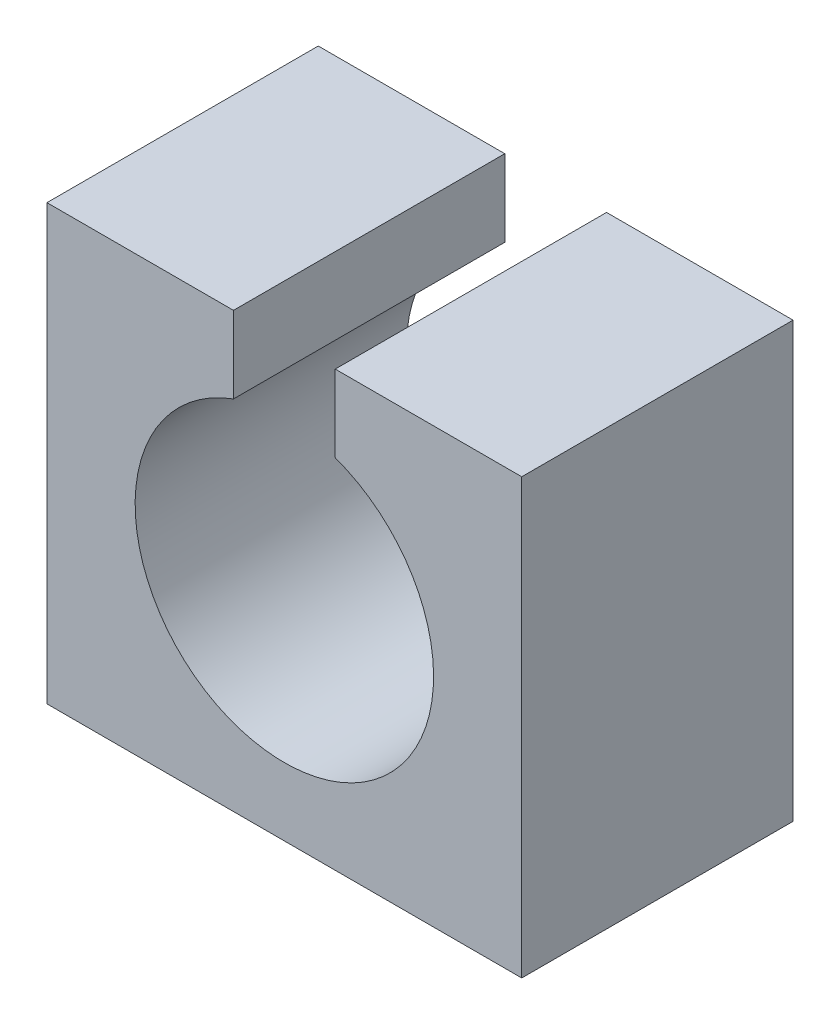
ISO-10303-21;
HEADER;
FILE_DESCRIPTION(('STEP AP214'),'2;1');
FILE_NAME('part.step','',(''),(''),'','','');
FILE_SCHEMA(('AUTOMOTIVE_DESIGN { 1 0 10303 214 1 1 1 1 }'));
ENDSEC;
DATA;
#1=APPLICATION_CONTEXT('core data for automotive mechanical design processes');
#2=APPLICATION_PROTOCOL_DEFINITION('international standard','automotive_design',2000,#1);
#3=PRODUCT_CONTEXT('',#1,'mechanical');
#4=PRODUCT('Part','Part','',(#3));
#5=PRODUCT_RELATED_PRODUCT_CATEGORY('part','',(#4));
#6=PRODUCT_DEFINITION_FORMATION('','',#4);
#7=PRODUCT_DEFINITION_CONTEXT('part definition',#1,'design');
#8=PRODUCT_DEFINITION('design','',#6,#7);
#9=PRODUCT_DEFINITION_SHAPE('','',#8);
#10=(LENGTH_UNIT() NAMED_UNIT(*) SI_UNIT(.MILLI.,.METRE.));
#11=(NAMED_UNIT(*) PLANE_ANGLE_UNIT() SI_UNIT($,.RADIAN.));
#12=(NAMED_UNIT(*) SI_UNIT($,.STERADIAN.) SOLID_ANGLE_UNIT());
#13=UNCERTAINTY_MEASURE_WITH_UNIT(LENGTH_MEASURE(1.E-05),#10,'distance_accuracy_value','');
#14=(GEOMETRIC_REPRESENTATION_CONTEXT(3) GLOBAL_UNCERTAINTY_ASSIGNED_CONTEXT((#13)) GLOBAL_UNIT_ASSIGNED_CONTEXT((#10,
#11,#12)) REPRESENTATION_CONTEXT('',''));
#15=CARTESIAN_POINT('',(0.,0.,0.));
#16=DIRECTION('',(0.,0.,1.));
#17=DIRECTION('',(1.,0.,0.));
#18=AXIS2_PLACEMENT_3D('',#15,#16,#17);
#19=CARTESIAN_POINT('',(-35.,32.,20.));
#20=DIRECTION('',(0.,-1.,0.));
#21=DIRECTION('',(0.,0.,-1.));
#22=AXIS2_PLACEMENT_3D('',#19,#20,#21);
#23=PLANE('',#22);
#24=DIRECTION('',(-1.,0.,0.));
#25=VECTOR('',#24,1.);
#26=CARTESIAN_POINT('',(-35.,32.,-20.));
#27=LINE('',#26,#25);
#28=CARTESIAN_POINT('',(35.,32.,-20.));
#29=VERTEX_POINT('',#28);
#30=CARTESIAN_POINT('',(7.5,32.,-20.));
#31=VERTEX_POINT('',#30);
#32=EDGE_CURVE('E110',#29,#31,#27,.T.);
#33=ORIENTED_EDGE('',*,*,#32,.T.);
#34=DIRECTION('',(0.,0.,-1.));
#35=VECTOR('',#34,1.);
#36=CARTESIAN_POINT('',(7.5,32.,20.));
#37=LINE('',#36,#35);
#38=CARTESIAN_POINT('',(7.5,32.,20.));
#39=VERTEX_POINT('',#38);
#40=EDGE_CURVE('E97',#39,#31,#37,.T.);
#41=ORIENTED_EDGE('',*,*,#40,.F.);
#42=DIRECTION('',(-1.,0.,0.));
#43=VECTOR('',#42,1.);
#44=CARTESIAN_POINT('',(-35.,32.,20.));
#45=LINE('',#44,#43);
#46=CARTESIAN_POINT('',(35.,32.,20.));
#47=VERTEX_POINT('',#46);
#48=EDGE_CURVE('E156',#47,#39,#45,.T.);
#49=ORIENTED_EDGE('',*,*,#48,.F.);
#50=DIRECTION('',(0.,0.,-1.));
#51=VECTOR('',#50,1.);
#52=CARTESIAN_POINT('',(35.,32.,20.));
#53=LINE('',#52,#51);
#54=EDGE_CURVE('E118',#47,#29,#53,.T.);
#55=ORIENTED_EDGE('',*,*,#54,.T.);
#56=EDGE_LOOP('',(#33,#41,#49,#55));
#57=FACE_BOUND('',#56,.T.);
#58=ADVANCED_FACE('F35',(#57),#23,.F.);
#59=CARTESIAN_POINT('',(35.,-32.,20.));
#60=DIRECTION('',(-1.,0.,0.));
#61=DIRECTION('',(0.,0.,1.));
#62=AXIS2_PLACEMENT_3D('',#59,#60,#61);
#63=PLANE('',#62);
#64=DIRECTION('',(0.,1.,0.));
#65=VECTOR('',#64,1.);
#66=CARTESIAN_POINT('',(35.,-32.,-20.));
#67=LINE('',#66,#65);
#68=CARTESIAN_POINT('',(35.,-32.,-20.));
#69=VERTEX_POINT('',#68);
#70=EDGE_CURVE('E125',#69,#29,#67,.T.);
#71=ORIENTED_EDGE('',*,*,#70,.T.);
#72=ORIENTED_EDGE('',*,*,#54,.F.);
#73=DIRECTION('',(0.,1.,0.));
#74=VECTOR('',#73,1.);
#75=CARTESIAN_POINT('',(35.,-32.,20.));
#76=LINE('',#75,#74);
#77=CARTESIAN_POINT('',(35.,-32.,20.));
#78=VERTEX_POINT('',#77);
#79=EDGE_CURVE('E130',#78,#47,#76,.T.);
#80=ORIENTED_EDGE('',*,*,#79,.F.);
#81=DIRECTION('',(0.,0.,-1.));
#82=VECTOR('',#81,1.);
#83=CARTESIAN_POINT('',(35.,-32.,20.));
#84=LINE('',#83,#82);
#85=EDGE_CURVE('E131',#78,#69,#84,.T.);
#86=ORIENTED_EDGE('',*,*,#85,.T.);
#87=EDGE_LOOP('',(#71,#72,#80,#86));
#88=FACE_BOUND('',#87,.T.);
#89=ADVANCED_FACE('F37',(#88),#63,.F.);
#90=CARTESIAN_POINT('',(-7.5,32.,20.));
#91=VERTEX_POINT('',#90);
#92=CARTESIAN_POINT('',(-35.,32.,20.));
#93=VERTEX_POINT('',#92);
#94=EDGE_CURVE('E155',#91,#93,#45,.T.);
#95=ORIENTED_EDGE('',*,*,#94,.F.);
#96=DIRECTION('',(0.,0.,1.));
#97=VECTOR('',#96,1.);
#98=CARTESIAN_POINT('',(-7.5,32.,20.));
#99=LINE('',#98,#97);
#100=CARTESIAN_POINT('',(-7.5,32.,-20.));
#101=VERTEX_POINT('',#100);
#102=EDGE_CURVE('E104',#101,#91,#99,.T.);
#103=ORIENTED_EDGE('',*,*,#102,.F.);
#104=CARTESIAN_POINT('',(-35.,32.,-20.));
#105=VERTEX_POINT('',#104);
#106=EDGE_CURVE('E121',#101,#105,#27,.T.);
#107=ORIENTED_EDGE('',*,*,#106,.T.);
#108=DIRECTION('',(0.,0.,-1.));
#109=VECTOR('',#108,1.);
#110=CARTESIAN_POINT('',(-35.,32.,20.));
#111=LINE('',#110,#109);
#112=EDGE_CURVE('E138',#93,#105,#111,.T.);
#113=ORIENTED_EDGE('',*,*,#112,.F.);
#114=EDGE_LOOP('',(#95,#103,#107,#113));
#115=FACE_BOUND('',#114,.T.);
#116=ADVANCED_FACE('F174',(#115),#23,.F.);
#117=CARTESIAN_POINT('',(-35.,-32.,20.));
#118=DIRECTION('',(1.,0.,0.));
#119=DIRECTION('',(0.,0.,-1.));
#120=AXIS2_PLACEMENT_3D('',#117,#118,#119);
#121=PLANE('',#120);
#122=DIRECTION('',(0.,-1.,0.));
#123=VECTOR('',#122,1.);
#124=CARTESIAN_POINT('',(-35.,-32.,-20.));
#125=LINE('',#124,#123);
#126=CARTESIAN_POINT('',(-35.,-32.,-20.));
#127=VERTEX_POINT('',#126);
#128=EDGE_CURVE('E120',#105,#127,#125,.T.);
#129=ORIENTED_EDGE('',*,*,#128,.T.);
#130=DIRECTION('',(0.,0.,-1.));
#131=VECTOR('',#130,1.);
#132=CARTESIAN_POINT('',(-35.,-32.,20.));
#133=LINE('',#132,#131);
#134=CARTESIAN_POINT('',(-35.,-32.,20.));
#135=VERTEX_POINT('',#134);
#136=EDGE_CURVE('E134',#135,#127,#133,.T.);
#137=ORIENTED_EDGE('',*,*,#136,.F.);
#138=DIRECTION('',(0.,-1.,0.));
#139=VECTOR('',#138,1.);
#140=CARTESIAN_POINT('',(-35.,-32.,20.));
#141=LINE('',#140,#139);
#142=EDGE_CURVE('E158',#93,#135,#141,.T.);
#143=ORIENTED_EDGE('',*,*,#142,.F.);
#144=ORIENTED_EDGE('',*,*,#112,.T.);
#145=EDGE_LOOP('',(#129,#137,#143,#144));
#146=FACE_BOUND('',#145,.T.);
#147=ADVANCED_FACE('F171',(#146),#121,.F.);
#148=CARTESIAN_POINT('',(-35.,-32.,20.));
#149=DIRECTION('',(0.,1.,0.));
#150=DIRECTION('',(0.,0.,1.));
#151=AXIS2_PLACEMENT_3D('',#148,#149,#150);
#152=PLANE('',#151);
#153=DIRECTION('',(1.,0.,0.));
#154=VECTOR('',#153,1.);
#155=CARTESIAN_POINT('',(-35.,-32.,-20.));
#156=LINE('',#155,#154);
#157=EDGE_CURVE('E123',#127,#69,#156,.T.);
#158=ORIENTED_EDGE('',*,*,#157,.T.);
#159=ORIENTED_EDGE('',*,*,#85,.F.);
#160=DIRECTION('',(1.,0.,0.));
#161=VECTOR('',#160,1.);
#162=CARTESIAN_POINT('',(-35.,-32.,20.));
#163=LINE('',#162,#161);
#164=EDGE_CURVE('E135',#135,#78,#163,.T.);
#165=ORIENTED_EDGE('',*,*,#164,.F.);
#166=ORIENTED_EDGE('',*,*,#136,.T.);
#167=EDGE_LOOP('',(#158,#159,#165,#166));
#168=FACE_BOUND('',#167,.T.);
#169=ADVANCED_FACE('F165',(#168),#152,.F.);
#170=CARTESIAN_POINT('',(0.,0.,20.));
#171=DIRECTION('',(0.,0.,-1.));
#172=DIRECTION('',(-1.,0.,0.));
#173=AXIS2_PLACEMENT_3D('',#170,#171,#172);
#174=PLANE('',#173);
#175=ORIENTED_EDGE('',*,*,#48,.T.);
#176=DIRECTION('',(0.,1.,0.));
#177=VECTOR('',#176,1.);
#178=CARTESIAN_POINT('',(7.5,12.,20.));
#179=LINE('',#178,#177);
#180=CARTESIAN_POINT('',(7.5,20.6821178799464,20.));
#181=VERTEX_POINT('',#180);
#182=EDGE_CURVE('E100',#181,#39,#179,.T.);
#183=ORIENTED_EDGE('',*,*,#182,.F.);
#184=CARTESIAN_POINT('',(0.,0.,20.));
#185=DIRECTION('',(0.,0.,1.));
#186=DIRECTION('',(1.,0.,0.));
#187=AXIS2_PLACEMENT_3D('',#184,#185,#186);
#188=CIRCLE('',#187,22.);
#189=CARTESIAN_POINT('',(-7.5,20.6821178799464,20.));
#190=VERTEX_POINT('',#189);
#191=EDGE_CURVE('E145',#190,#181,#188,.T.);
#192=ORIENTED_EDGE('',*,*,#191,.F.);
#193=DIRECTION('',(0.,1.,0.));
#194=VECTOR('',#193,1.);
#195=CARTESIAN_POINT('',(-7.5,12.,20.));
#196=LINE('',#195,#194);
#197=EDGE_CURVE('E50',#190,#91,#196,.T.);
#198=ORIENTED_EDGE('',*,*,#197,.T.);
#199=ORIENTED_EDGE('',*,*,#94,.T.);
#200=ORIENTED_EDGE('',*,*,#142,.T.);
#201=ORIENTED_EDGE('',*,*,#164,.T.);
#202=ORIENTED_EDGE('',*,*,#79,.T.);
#203=EDGE_LOOP('',(#175,#183,#192,#198,#199,#200,#201,#202));
#204=FACE_BOUND('',#203,.T.);
#205=ADVANCED_FACE('F147',(#204),#174,.F.);
#206=CARTESIAN_POINT('',(0.,0.,-20.));
#207=DIRECTION('',(0.,0.,-1.));
#208=DIRECTION('',(-1.,0.,0.));
#209=AXIS2_PLACEMENT_3D('',#206,#207,#208);
#210=PLANE('',#209);
#211=DIRECTION('',(0.,1.,0.));
#212=VECTOR('',#211,1.);
#213=CARTESIAN_POINT('',(7.5,12.,-20.));
#214=LINE('',#213,#212);
#215=CARTESIAN_POINT('',(7.5,20.6821178799464,-20.));
#216=VERTEX_POINT('',#215);
#217=EDGE_CURVE('E58',#216,#31,#214,.T.);
#218=ORIENTED_EDGE('',*,*,#217,.T.);
#219=ORIENTED_EDGE('',*,*,#32,.F.);
#220=ORIENTED_EDGE('',*,*,#70,.F.);
#221=ORIENTED_EDGE('',*,*,#157,.F.);
#222=ORIENTED_EDGE('',*,*,#128,.F.);
#223=ORIENTED_EDGE('',*,*,#106,.F.);
#224=DIRECTION('',(0.,1.,0.));
#225=VECTOR('',#224,1.);
#226=CARTESIAN_POINT('',(-7.5,12.,-20.));
#227=LINE('',#226,#225);
#228=CARTESIAN_POINT('',(-7.5,20.6821178799464,-20.));
#229=VERTEX_POINT('',#228);
#230=EDGE_CURVE('E115',#229,#101,#227,.T.);
#231=ORIENTED_EDGE('',*,*,#230,.F.);
#232=CARTESIAN_POINT('',(0.,0.,-20.));
#233=DIRECTION('',(0.,0.,1.));
#234=DIRECTION('',(1.,0.,0.));
#235=AXIS2_PLACEMENT_3D('',#232,#233,#234);
#236=CIRCLE('',#235,22.);
#237=EDGE_CURVE('E114',#229,#216,#236,.T.);
#238=ORIENTED_EDGE('',*,*,#237,.T.);
#239=EDGE_LOOP('',(#218,#219,#220,#221,#222,#223,#231,#238));
#240=FACE_BOUND('',#239,.T.);
#241=ADVANCED_FACE('F108',(#240),#210,.T.);
#242=CARTESIAN_POINT('',(0.,0.,-20.));
#243=DIRECTION('',(0.,0.,1.));
#244=DIRECTION('',(1.,0.,0.));
#245=AXIS2_PLACEMENT_3D('',#242,#243,#244);
#246=CYLINDRICAL_SURFACE('',#245,22.);
#247=ORIENTED_EDGE('',*,*,#191,.T.);
#248=DIRECTION('',(0.,0.,1.));
#249=VECTOR('',#248,1.);
#250=CARTESIAN_POINT('',(7.5,20.6821178799464,-20.));
#251=LINE('',#250,#249);
#252=EDGE_CURVE('E11',#181,#216,#251,.F.);
#253=ORIENTED_EDGE('',*,*,#252,.T.);
#254=ORIENTED_EDGE('',*,*,#237,.F.);
#255=DIRECTION('',(0.,0.,1.));
#256=VECTOR('',#255,1.);
#257=CARTESIAN_POINT('',(-7.5,20.6821178799464,-20.));
#258=LINE('',#257,#256);
#259=EDGE_CURVE('E43',#229,#190,#258,.T.);
#260=ORIENTED_EDGE('',*,*,#259,.T.);
#261=EDGE_LOOP('',(#247,#253,#254,#260));
#262=FACE_BOUND('',#261,.T.);
#263=ADVANCED_FACE('F144',(#262),#246,.F.);
#264=CARTESIAN_POINT('',(-7.5,12.,20.));
#265=DIRECTION('',(-1.,0.,0.));
#266=DIRECTION('',(0.,0.,1.));
#267=AXIS2_PLACEMENT_3D('',#264,#265,#266);
#268=PLANE('',#267);
#269=ORIENTED_EDGE('',*,*,#230,.T.);
#270=ORIENTED_EDGE('',*,*,#102,.T.);
#271=ORIENTED_EDGE('',*,*,#197,.F.);
#272=ORIENTED_EDGE('',*,*,#259,.F.);
#273=EDGE_LOOP('',(#269,#270,#271,#272));
#274=FACE_BOUND('',#273,.T.);
#275=ADVANCED_FACE('F179',(#274),#268,.F.);
#276=CARTESIAN_POINT('',(7.5,12.,20.));
#277=DIRECTION('',(1.,0.,0.));
#278=DIRECTION('',(0.,0.,-1.));
#279=AXIS2_PLACEMENT_3D('',#276,#277,#278);
#280=PLANE('',#279);
#281=ORIENTED_EDGE('',*,*,#182,.T.);
#282=ORIENTED_EDGE('',*,*,#40,.T.);
#283=ORIENTED_EDGE('',*,*,#217,.F.);
#284=ORIENTED_EDGE('',*,*,#252,.F.);
#285=EDGE_LOOP('',(#281,#282,#283,#284));
#286=FACE_BOUND('',#285,.T.);
#287=ADVANCED_FACE('F98',(#286),#280,.F.);
#288=CLOSED_SHELL('',(#58,#89,#116,#147,#169,#205,#241,#263,#275,#287));
#289=MANIFOLD_SOLID_BREP('B2',#288);
#290=ADVANCED_BREP_SHAPE_REPRESENTATION('',(#18,#289),#14);
#291=SHAPE_DEFINITION_REPRESENTATION(#9,#290);
ENDSEC;
END-ISO-10303-21;
